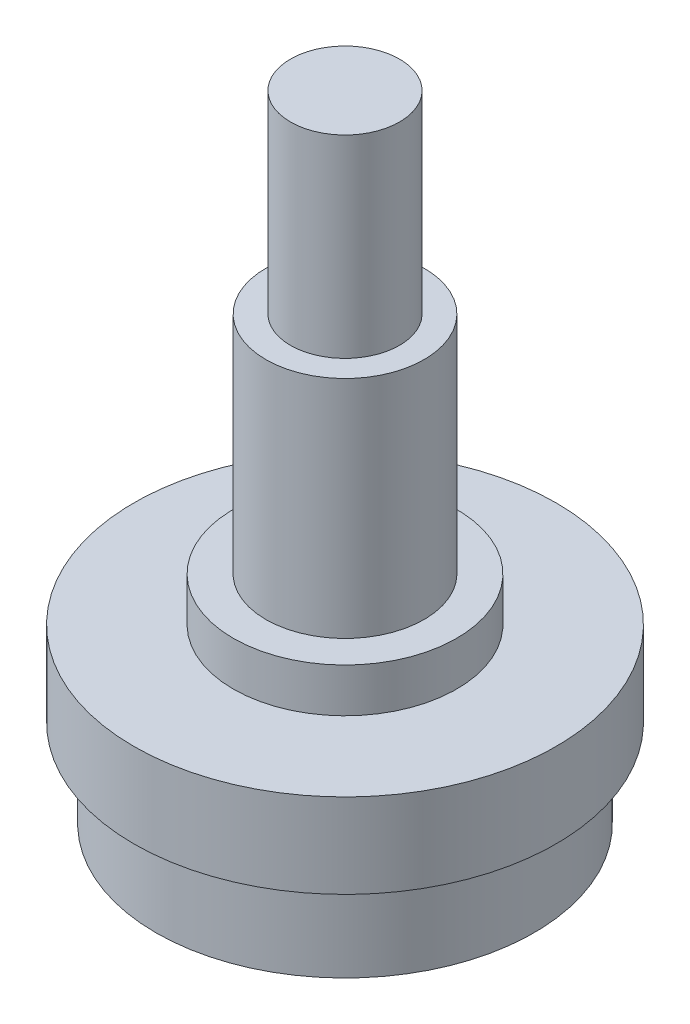
ISO-10303-21;
HEADER;
FILE_DESCRIPTION(('STEP AP214'),'2;1');
FILE_NAME('part.step','',(''),(''),'','','');
FILE_SCHEMA(('AUTOMOTIVE_DESIGN { 1 0 10303 214 1 1 1 1 }'));
ENDSEC;
DATA;
#1=APPLICATION_CONTEXT('core data for automotive mechanical design processes');
#2=APPLICATION_PROTOCOL_DEFINITION('international standard','automotive_design',2000,#1);
#3=PRODUCT_CONTEXT('',#1,'mechanical');
#4=PRODUCT('Part','Part','',(#3));
#5=PRODUCT_RELATED_PRODUCT_CATEGORY('part','',(#4));
#6=PRODUCT_DEFINITION_FORMATION('','',#4);
#7=PRODUCT_DEFINITION_CONTEXT('part definition',#1,'design');
#8=PRODUCT_DEFINITION('design','',#6,#7);
#9=PRODUCT_DEFINITION_SHAPE('','',#8);
#10=(LENGTH_UNIT() NAMED_UNIT(*) SI_UNIT(.MILLI.,.METRE.));
#11=(NAMED_UNIT(*) PLANE_ANGLE_UNIT() SI_UNIT($,.RADIAN.));
#12=(NAMED_UNIT(*) SI_UNIT($,.STERADIAN.) SOLID_ANGLE_UNIT());
#13=UNCERTAINTY_MEASURE_WITH_UNIT(LENGTH_MEASURE(1.E-05),#10,'distance_accuracy_value','');
#14=(GEOMETRIC_REPRESENTATION_CONTEXT(3) GLOBAL_UNCERTAINTY_ASSIGNED_CONTEXT((#13)) GLOBAL_UNIT_ASSIGNED_CONTEXT((#10,
#11,#12)) REPRESENTATION_CONTEXT('',''));
#15=CARTESIAN_POINT('',(0.,0.,0.));
#16=DIRECTION('',(0.,0.,1.));
#17=DIRECTION('',(1.,0.,0.));
#18=AXIS2_PLACEMENT_3D('',#15,#16,#17);
#19=CARTESIAN_POINT('',(0.,25.1,0.));
#20=DIRECTION('',(0.,1.,0.));
#21=DIRECTION('',(0.,0.,1.));
#22=AXIS2_PLACEMENT_3D('',#19,#20,#21);
#23=PLANE('',#22);
#24=CARTESIAN_POINT('',(0.,25.1,0.));
#25=DIRECTION('',(0.,1.,0.));
#26=DIRECTION('',(0.,0.,1.));
#27=AXIS2_PLACEMENT_3D('',#24,#25,#26);
#28=CIRCLE('',#27,4.5);
#29=CARTESIAN_POINT('',(0.,25.1,4.5));
#30=VERTEX_POINT('',#29);
#31=EDGE_CURVE('E53',#30,#30,#28,.T.);
#32=ORIENTED_EDGE('',*,*,#31,.T.);
#33=EDGE_LOOP('',(#32));
#34=FACE_BOUND('',#33,.T.);
#35=CARTESIAN_POINT('',(0.,25.1,0.));
#36=DIRECTION('',(0.,1.,0.));
#37=DIRECTION('',(0.,0.,1.));
#38=AXIS2_PLACEMENT_3D('',#35,#36,#37);
#39=CIRCLE('',#38,3.1);
#40=CARTESIAN_POINT('',(0.,25.1,3.1));
#41=VERTEX_POINT('',#40);
#42=EDGE_CURVE('E62',#41,#41,#39,.T.);
#43=ORIENTED_EDGE('',*,*,#42,.F.);
#44=EDGE_LOOP('',(#43));
#45=FACE_BOUND('',#44,.T.);
#46=ADVANCED_FACE('F31',(#34,#45),#23,.T.);
#47=CARTESIAN_POINT('',(0.,12.3,0.));
#48=DIRECTION('',(0.,1.,0.));
#49=DIRECTION('',(0.,0.,1.));
#50=AXIS2_PLACEMENT_3D('',#47,#48,#49);
#51=PLANE('',#50);
#52=CARTESIAN_POINT('',(0.,12.3,0.));
#53=DIRECTION('',(0.,1.,0.));
#54=DIRECTION('',(0.,0.,1.));
#55=AXIS2_PLACEMENT_3D('',#52,#53,#54);
#56=CIRCLE('',#55,6.35);
#57=CARTESIAN_POINT('',(0.,12.3,6.35));
#58=VERTEX_POINT('',#57);
#59=EDGE_CURVE('E47',#58,#58,#56,.T.);
#60=ORIENTED_EDGE('',*,*,#59,.T.);
#61=EDGE_LOOP('',(#60));
#62=FACE_BOUND('',#61,.T.);
#63=CARTESIAN_POINT('',(0.,12.3,0.));
#64=DIRECTION('',(0.,1.,0.));
#65=DIRECTION('',(0.,0.,1.));
#66=AXIS2_PLACEMENT_3D('',#63,#64,#65);
#67=CIRCLE('',#66,4.5);
#68=CARTESIAN_POINT('',(0.,12.3,4.5));
#69=VERTEX_POINT('',#68);
#70=EDGE_CURVE('E56',#69,#69,#67,.T.);
#71=ORIENTED_EDGE('',*,*,#70,.F.);
#72=EDGE_LOOP('',(#71));
#73=FACE_BOUND('',#72,.T.);
#74=ADVANCED_FACE('F78',(#62,#73),#51,.T.);
#75=CARTESIAN_POINT('',(0.,9.8,0.));
#76=DIRECTION('',(0.,1.,0.));
#77=DIRECTION('',(0.,0.,1.));
#78=AXIS2_PLACEMENT_3D('',#75,#76,#77);
#79=PLANE('',#78);
#80=CARTESIAN_POINT('',(0.,9.8,0.));
#81=DIRECTION('',(0.,1.,0.));
#82=DIRECTION('',(0.,0.,1.));
#83=AXIS2_PLACEMENT_3D('',#80,#81,#82);
#84=CIRCLE('',#83,12.);
#85=CARTESIAN_POINT('',(0.,9.8,12.));
#86=VERTEX_POINT('',#85);
#87=EDGE_CURVE('E42',#86,#86,#84,.T.);
#88=ORIENTED_EDGE('',*,*,#87,.T.);
#89=EDGE_LOOP('',(#88));
#90=FACE_BOUND('',#89,.T.);
#91=CARTESIAN_POINT('',(0.,9.8,0.));
#92=DIRECTION('',(0.,1.,0.));
#93=DIRECTION('',(0.,0.,1.));
#94=AXIS2_PLACEMENT_3D('',#91,#92,#93);
#95=CIRCLE('',#94,6.35);
#96=CARTESIAN_POINT('',(0.,9.8,6.35));
#97=VERTEX_POINT('',#96);
#98=EDGE_CURVE('E50',#97,#97,#95,.T.);
#99=ORIENTED_EDGE('',*,*,#98,.F.);
#100=EDGE_LOOP('',(#99));
#101=FACE_BOUND('',#100,.T.);
#102=ADVANCED_FACE('F84',(#90,#101),#79,.T.);
#103=CARTESIAN_POINT('',(0.,5.,0.));
#104=DIRECTION('',(0.,-1.,0.));
#105=DIRECTION('',(0.,0.,-1.));
#106=AXIS2_PLACEMENT_3D('',#103,#104,#105);
#107=CYLINDRICAL_SURFACE('',#106,10.75);
#108=CARTESIAN_POINT('',(0.,5.,0.));
#109=DIRECTION('',(0.,1.,0.));
#110=DIRECTION('',(0.,0.,1.));
#111=AXIS2_PLACEMENT_3D('',#108,#109,#110);
#112=CIRCLE('',#111,10.75);
#113=CARTESIAN_POINT('',(0.,5.,10.75));
#114=VERTEX_POINT('',#113);
#115=EDGE_CURVE('E10',#114,#114,#112,.T.);
#116=ORIENTED_EDGE('',*,*,#115,.F.);
#117=EDGE_LOOP('',(#116));
#118=FACE_BOUND('',#117,.T.);
#119=CARTESIAN_POINT('',(0.,0.,0.));
#120=DIRECTION('',(0.,1.,0.));
#121=DIRECTION('',(0.,0.,1.));
#122=AXIS2_PLACEMENT_3D('',#119,#120,#121);
#123=CIRCLE('',#122,10.75);
#124=CARTESIAN_POINT('',(0.,0.,10.75));
#125=VERTEX_POINT('',#124);
#126=EDGE_CURVE('E35',#125,#125,#123,.T.);
#127=ORIENTED_EDGE('',*,*,#126,.T.);
#128=EDGE_LOOP('',(#127));
#129=FACE_BOUND('',#128,.T.);
#130=ADVANCED_FACE('F33',(#118,#129),#107,.T.);
#131=CARTESIAN_POINT('',(0.,0.,0.));
#132=DIRECTION('',(0.,1.,0.));
#133=DIRECTION('',(0.,0.,1.));
#134=AXIS2_PLACEMENT_3D('',#131,#132,#133);
#135=PLANE('',#134);
#136=ORIENTED_EDGE('',*,*,#126,.F.);
#137=EDGE_LOOP('',(#136));
#138=FACE_BOUND('',#137,.T.);
#139=ADVANCED_FACE('F103',(#138),#135,.F.);
#140=CARTESIAN_POINT('',(0.,5.,0.));
#141=DIRECTION('',(0.,1.,0.));
#142=DIRECTION('',(0.,0.,1.));
#143=AXIS2_PLACEMENT_3D('',#140,#141,#142);
#144=PLANE('',#143);
#145=CARTESIAN_POINT('',(0.,5.,0.));
#146=DIRECTION('',(0.,1.,0.));
#147=DIRECTION('',(0.,0.,1.));
#148=AXIS2_PLACEMENT_3D('',#145,#146,#147);
#149=CIRCLE('',#148,12.);
#150=CARTESIAN_POINT('',(0.,5.,12.));
#151=VERTEX_POINT('',#150);
#152=EDGE_CURVE('E44',#151,#151,#149,.T.);
#153=ORIENTED_EDGE('',*,*,#152,.F.);
#154=EDGE_LOOP('',(#153));
#155=FACE_BOUND('',#154,.T.);
#156=ORIENTED_EDGE('',*,*,#115,.T.);
#157=EDGE_LOOP('',(#156));
#158=FACE_BOUND('',#157,.T.);
#159=ADVANCED_FACE('F100',(#155,#158),#144,.F.);
#160=CARTESIAN_POINT('',(0.,9.8,0.));
#161=DIRECTION('',(0.,-1.,0.));
#162=DIRECTION('',(0.,0.,-1.));
#163=AXIS2_PLACEMENT_3D('',#160,#161,#162);
#164=CYLINDRICAL_SURFACE('',#163,12.);
#165=ORIENTED_EDGE('',*,*,#87,.F.);
#166=EDGE_LOOP('',(#165));
#167=FACE_BOUND('',#166,.T.);
#168=ORIENTED_EDGE('',*,*,#152,.T.);
#169=EDGE_LOOP('',(#168));
#170=FACE_BOUND('',#169,.T.);
#171=ADVANCED_FACE('F95',(#167,#170),#164,.T.);
#172=CARTESIAN_POINT('',(0.,12.3,0.));
#173=DIRECTION('',(0.,-1.,0.));
#174=DIRECTION('',(0.,0.,-1.));
#175=AXIS2_PLACEMENT_3D('',#172,#173,#174);
#176=CYLINDRICAL_SURFACE('',#175,6.35);
#177=ORIENTED_EDGE('',*,*,#59,.F.);
#178=EDGE_LOOP('',(#177));
#179=FACE_BOUND('',#178,.T.);
#180=ORIENTED_EDGE('',*,*,#98,.T.);
#181=EDGE_LOOP('',(#180));
#182=FACE_BOUND('',#181,.T.);
#183=ADVANCED_FACE('F90',(#179,#182),#176,.T.);
#184=CARTESIAN_POINT('',(0.,25.1,0.));
#185=DIRECTION('',(0.,-1.,0.));
#186=DIRECTION('',(0.,0.,-1.));
#187=AXIS2_PLACEMENT_3D('',#184,#185,#186);
#188=CYLINDRICAL_SURFACE('',#187,4.5);
#189=ORIENTED_EDGE('',*,*,#31,.F.);
#190=EDGE_LOOP('',(#189));
#191=FACE_BOUND('',#190,.T.);
#192=ORIENTED_EDGE('',*,*,#70,.T.);
#193=EDGE_LOOP('',(#192));
#194=FACE_BOUND('',#193,.T.);
#195=ADVANCED_FACE('F73',(#191,#194),#188,.T.);
#196=CARTESIAN_POINT('',(0.,36.1,0.));
#197=DIRECTION('',(0.,-1.,0.));
#198=DIRECTION('',(0.,0.,-1.));
#199=AXIS2_PLACEMENT_3D('',#196,#197,#198);
#200=CYLINDRICAL_SURFACE('',#199,3.1);
#201=CARTESIAN_POINT('',(0.,36.1,0.));
#202=DIRECTION('',(0.,1.,0.));
#203=DIRECTION('',(0.,0.,1.));
#204=AXIS2_PLACEMENT_3D('',#201,#202,#203);
#205=CIRCLE('',#204,3.1);
#206=CARTESIAN_POINT('',(0.,36.1,3.1));
#207=VERTEX_POINT('',#206);
#208=EDGE_CURVE('E59',#207,#207,#205,.T.);
#209=ORIENTED_EDGE('',*,*,#208,.F.);
#210=EDGE_LOOP('',(#209));
#211=FACE_BOUND('',#210,.T.);
#212=ORIENTED_EDGE('',*,*,#42,.T.);
#213=EDGE_LOOP('',(#212));
#214=FACE_BOUND('',#213,.T.);
#215=ADVANCED_FACE('F70',(#211,#214),#200,.T.);
#216=CARTESIAN_POINT('',(0.,36.1,0.));
#217=DIRECTION('',(0.,1.,0.));
#218=DIRECTION('',(0.,0.,1.));
#219=AXIS2_PLACEMENT_3D('',#216,#217,#218);
#220=PLANE('',#219);
#221=ORIENTED_EDGE('',*,*,#208,.T.);
#222=EDGE_LOOP('',(#221));
#223=FACE_BOUND('',#222,.T.);
#224=ADVANCED_FACE('F68',(#223),#220,.T.);
#225=CLOSED_SHELL('',(#46,#74,#102,#130,#139,#159,#171,#183,#195,#215,#224));
#226=MANIFOLD_SOLID_BREP('B2',#225);
#227=ADVANCED_BREP_SHAPE_REPRESENTATION('',(#18,#226),#14);
#228=SHAPE_DEFINITION_REPRESENTATION(#9,#227);
ENDSEC;
END-ISO-10303-21;
